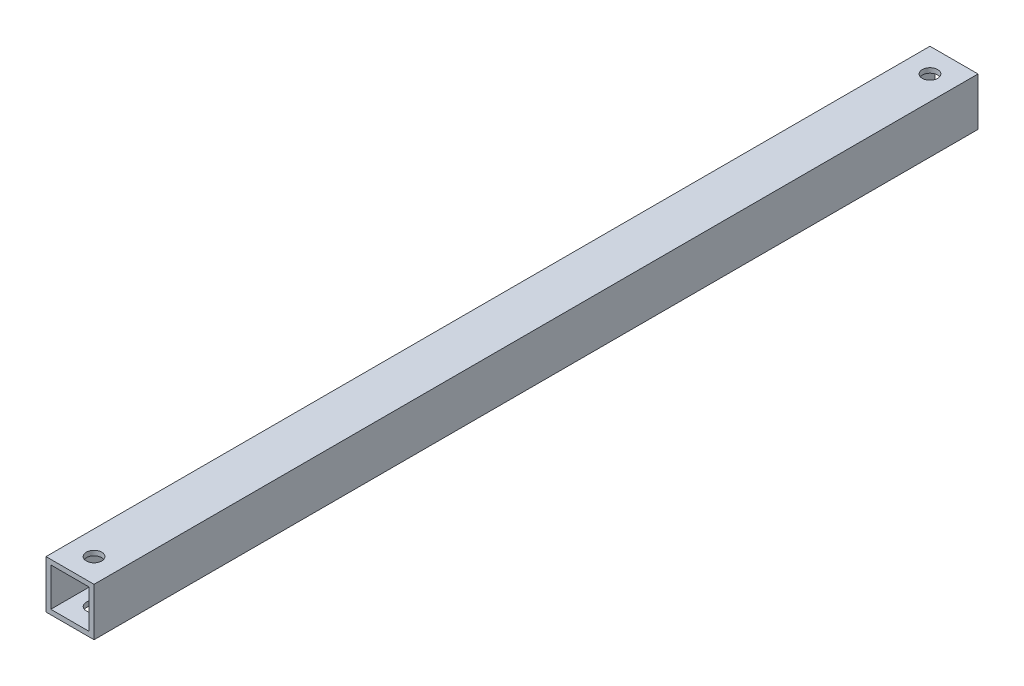
ISO-10303-21;
HEADER;
FILE_DESCRIPTION(('STEP AP214'),'2;1');
FILE_NAME('part.step','',(''),(''),'','','');
FILE_SCHEMA(('AUTOMOTIVE_DESIGN { 1 0 10303 214 1 1 1 1 }'));
ENDSEC;
DATA;
#1=APPLICATION_CONTEXT('core data for automotive mechanical design processes');
#2=APPLICATION_PROTOCOL_DEFINITION('international standard','automotive_design',2000,#1);
#3=PRODUCT_CONTEXT('',#1,'mechanical');
#4=PRODUCT('Part','Part','',(#3));
#5=PRODUCT_RELATED_PRODUCT_CATEGORY('part','',(#4));
#6=PRODUCT_DEFINITION_FORMATION('','',#4);
#7=PRODUCT_DEFINITION_CONTEXT('part definition',#1,'design');
#8=PRODUCT_DEFINITION('design','',#6,#7);
#9=PRODUCT_DEFINITION_SHAPE('','',#8);
#10=(LENGTH_UNIT() NAMED_UNIT(*) SI_UNIT(.MILLI.,.METRE.));
#11=(NAMED_UNIT(*) PLANE_ANGLE_UNIT() SI_UNIT($,.RADIAN.));
#12=(NAMED_UNIT(*) SI_UNIT($,.STERADIAN.) SOLID_ANGLE_UNIT());
#13=UNCERTAINTY_MEASURE_WITH_UNIT(LENGTH_MEASURE(1.E-05),#10,'distance_accuracy_value','');
#14=(GEOMETRIC_REPRESENTATION_CONTEXT(3) GLOBAL_UNCERTAINTY_ASSIGNED_CONTEXT((#13)) GLOBAL_UNIT_ASSIGNED_CONTEXT((#10,
#11,#12)) REPRESENTATION_CONTEXT('',''));
#15=CARTESIAN_POINT('',(0.,0.,0.));
#16=DIRECTION('',(0.,0.,1.));
#17=DIRECTION('',(1.,0.,0.));
#18=AXIS2_PLACEMENT_3D('',#15,#16,#17);
#19=CARTESIAN_POINT('',(0.,0.,184.));
#20=DIRECTION('',(0.,0.,1.));
#21=DIRECTION('',(1.,0.,0.));
#22=AXIS2_PLACEMENT_3D('',#19,#20,#21);
#23=PLANE('',#22);
#24=DIRECTION('',(0.,1.,0.));
#25=VECTOR('',#24,1.);
#26=CARTESIAN_POINT('',(5.,-5.,184.));
#27=LINE('',#26,#25);
#28=CARTESIAN_POINT('',(5.,-5.,184.));
#29=VERTEX_POINT('',#28);
#30=CARTESIAN_POINT('',(5.,5.,184.));
#31=VERTEX_POINT('',#30);
#32=EDGE_CURVE('E162',#29,#31,#27,.T.);
#33=ORIENTED_EDGE('',*,*,#32,.T.);
#34=DIRECTION('',(-1.,0.,0.));
#35=VECTOR('',#34,1.);
#36=CARTESIAN_POINT('',(-5.,5.,184.));
#37=LINE('',#36,#35);
#38=CARTESIAN_POINT('',(-5.,5.,184.));
#39=VERTEX_POINT('',#38);
#40=EDGE_CURVE('E165',#31,#39,#37,.T.);
#41=ORIENTED_EDGE('',*,*,#40,.T.);
#42=DIRECTION('',(0.,-1.,0.));
#43=VECTOR('',#42,1.);
#44=CARTESIAN_POINT('',(-5.,-5.,184.));
#45=LINE('',#44,#43);
#46=CARTESIAN_POINT('',(-5.,-5.,184.));
#47=VERTEX_POINT('',#46);
#48=EDGE_CURVE('E168',#39,#47,#45,.T.);
#49=ORIENTED_EDGE('',*,*,#48,.T.);
#50=DIRECTION('',(1.,0.,0.));
#51=VECTOR('',#50,1.);
#52=CARTESIAN_POINT('',(-5.,-5.,184.));
#53=LINE('',#52,#51);
#54=EDGE_CURVE('E170',#47,#29,#53,.T.);
#55=ORIENTED_EDGE('',*,*,#54,.T.);
#56=EDGE_LOOP('',(#33,#41,#49,#55));
#57=FACE_BOUND('',#56,.T.);
#58=DIRECTION('',(-1.,0.,0.));
#59=VECTOR('',#58,1.);
#60=CARTESIAN_POINT('',(0.,4.,184.));
#61=LINE('',#60,#59);
#62=CARTESIAN_POINT('',(4.,4.,184.));
#63=VERTEX_POINT('',#62);
#64=CARTESIAN_POINT('',(-4.,4.,184.));
#65=VERTEX_POINT('',#64);
#66=EDGE_CURVE('E132',#63,#65,#61,.T.);
#67=ORIENTED_EDGE('',*,*,#66,.F.);
#68=DIRECTION('',(0.,1.,0.));
#69=VECTOR('',#68,1.);
#70=CARTESIAN_POINT('',(4.,0.,184.));
#71=LINE('',#70,#69);
#72=CARTESIAN_POINT('',(4.,-4.,184.));
#73=VERTEX_POINT('',#72);
#74=EDGE_CURVE('E124',#73,#63,#71,.T.);
#75=ORIENTED_EDGE('',*,*,#74,.F.);
#76=DIRECTION('',(1.,0.,0.));
#77=VECTOR('',#76,1.);
#78=CARTESIAN_POINT('',(0.,-4.,184.));
#79=LINE('',#78,#77);
#80=CARTESIAN_POINT('',(-4.,-4.,184.));
#81=VERTEX_POINT('',#80);
#82=EDGE_CURVE('E146',#81,#73,#79,.T.);
#83=ORIENTED_EDGE('',*,*,#82,.F.);
#84=DIRECTION('',(0.,-1.,0.));
#85=VECTOR('',#84,1.);
#86=CARTESIAN_POINT('',(-4.,0.,184.));
#87=LINE('',#86,#85);
#88=EDGE_CURVE('E144',#65,#81,#87,.T.);
#89=ORIENTED_EDGE('',*,*,#88,.F.);
#90=EDGE_LOOP('',(#67,#75,#83,#89));
#91=FACE_BOUND('',#90,.T.);
#92=ADVANCED_FACE('F57',(#57,#91),#23,.T.);
#93=CARTESIAN_POINT('',(0.,0.,0.));
#94=DIRECTION('',(0.,0.,1.));
#95=DIRECTION('',(1.,0.,0.));
#96=AXIS2_PLACEMENT_3D('',#93,#94,#95);
#97=PLANE('',#96);
#98=DIRECTION('',(0.,1.,0.));
#99=VECTOR('',#98,1.);
#100=CARTESIAN_POINT('',(5.,-5.,0.));
#101=LINE('',#100,#99);
#102=CARTESIAN_POINT('',(5.,-5.,0.));
#103=VERTEX_POINT('',#102);
#104=CARTESIAN_POINT('',(5.,5.,0.));
#105=VERTEX_POINT('',#104);
#106=EDGE_CURVE('E140',#103,#105,#101,.T.);
#107=ORIENTED_EDGE('',*,*,#106,.F.);
#108=DIRECTION('',(1.,0.,0.));
#109=VECTOR('',#108,1.);
#110=CARTESIAN_POINT('',(-5.,-5.,0.));
#111=LINE('',#110,#109);
#112=CARTESIAN_POINT('',(-5.,-5.,0.));
#113=VERTEX_POINT('',#112);
#114=EDGE_CURVE('E166',#113,#103,#111,.T.);
#115=ORIENTED_EDGE('',*,*,#114,.F.);
#116=DIRECTION('',(0.,-1.,0.));
#117=VECTOR('',#116,1.);
#118=CARTESIAN_POINT('',(-5.,-5.,0.));
#119=LINE('',#118,#117);
#120=CARTESIAN_POINT('',(-5.,5.,0.));
#121=VERTEX_POINT('',#120);
#122=EDGE_CURVE('E177',#121,#113,#119,.T.);
#123=ORIENTED_EDGE('',*,*,#122,.F.);
#124=DIRECTION('',(-1.,0.,0.));
#125=VECTOR('',#124,1.);
#126=CARTESIAN_POINT('',(-5.,5.,0.));
#127=LINE('',#126,#125);
#128=EDGE_CURVE('E175',#105,#121,#127,.T.);
#129=ORIENTED_EDGE('',*,*,#128,.F.);
#130=EDGE_LOOP('',(#107,#115,#123,#129));
#131=FACE_BOUND('',#130,.T.);
#132=DIRECTION('',(0.,1.,0.));
#133=VECTOR('',#132,1.);
#134=CARTESIAN_POINT('',(4.,0.,0.));
#135=LINE('',#134,#133);
#136=CARTESIAN_POINT('',(4.,-4.,0.));
#137=VERTEX_POINT('',#136);
#138=CARTESIAN_POINT('',(4.,4.,0.));
#139=VERTEX_POINT('',#138);
#140=EDGE_CURVE('E82',#137,#139,#135,.T.);
#141=ORIENTED_EDGE('',*,*,#140,.T.);
#142=DIRECTION('',(-1.,0.,0.));
#143=VECTOR('',#142,1.);
#144=CARTESIAN_POINT('',(0.,4.,0.));
#145=LINE('',#144,#143);
#146=CARTESIAN_POINT('',(-4.,4.,0.));
#147=VERTEX_POINT('',#146);
#148=EDGE_CURVE('E139',#139,#147,#145,.T.);
#149=ORIENTED_EDGE('',*,*,#148,.T.);
#150=DIRECTION('',(0.,-1.,0.));
#151=VECTOR('',#150,1.);
#152=CARTESIAN_POINT('',(-4.,0.,0.));
#153=LINE('',#152,#151);
#154=CARTESIAN_POINT('',(-4.,-4.,0.));
#155=VERTEX_POINT('',#154);
#156=EDGE_CURVE('E154',#147,#155,#153,.T.);
#157=ORIENTED_EDGE('',*,*,#156,.T.);
#158=DIRECTION('',(1.,0.,0.));
#159=VECTOR('',#158,1.);
#160=CARTESIAN_POINT('',(0.,-4.,0.));
#161=LINE('',#160,#159);
#162=EDGE_CURVE('E133',#155,#137,#161,.T.);
#163=ORIENTED_EDGE('',*,*,#162,.T.);
#164=EDGE_LOOP('',(#141,#149,#157,#163));
#165=FACE_BOUND('',#164,.T.);
#166=ADVANCED_FACE('F224',(#131,#165),#97,.F.);
#167=CARTESIAN_POINT('',(5.,-5.,184.));
#168=DIRECTION('',(-1.,0.,0.));
#169=DIRECTION('',(0.,0.,1.));
#170=AXIS2_PLACEMENT_3D('',#167,#168,#169);
#171=PLANE('',#170);
#172=ORIENTED_EDGE('',*,*,#106,.T.);
#173=DIRECTION('',(0.,0.,-1.));
#174=VECTOR('',#173,1.);
#175=CARTESIAN_POINT('',(5.,5.,184.));
#176=LINE('',#175,#174);
#177=EDGE_CURVE('E12',#31,#105,#176,.T.);
#178=ORIENTED_EDGE('',*,*,#177,.F.);
#179=ORIENTED_EDGE('',*,*,#32,.F.);
#180=DIRECTION('',(0.,0.,-1.));
#181=VECTOR('',#180,1.);
#182=CARTESIAN_POINT('',(5.,-5.,184.));
#183=LINE('',#182,#181);
#184=EDGE_CURVE('E172',#29,#103,#183,.T.);
#185=ORIENTED_EDGE('',*,*,#184,.T.);
#186=EDGE_LOOP('',(#172,#178,#179,#185));
#187=FACE_BOUND('',#186,.T.);
#188=ADVANCED_FACE('F59',(#187),#171,.F.);
#189=CARTESIAN_POINT('',(-5.,5.,184.));
#190=DIRECTION('',(0.,-1.,0.));
#191=DIRECTION('',(0.,0.,-1.));
#192=AXIS2_PLACEMENT_3D('',#189,#190,#191);
#193=PLANE('',#192);
#194=CARTESIAN_POINT('',(0.,5.,5.));
#195=DIRECTION('',(0.,1.,0.));
#196=DIRECTION('',(0.,0.,1.));
#197=AXIS2_PLACEMENT_3D('',#194,#195,#196);
#198=CIRCLE('',#197,1.6);
#199=CARTESIAN_POINT('',(0.,5.,6.6));
#200=VERTEX_POINT('',#199);
#201=EDGE_CURVE('E195',#200,#200,#198,.T.);
#202=ORIENTED_EDGE('',*,*,#201,.F.);
#203=EDGE_LOOP('',(#202));
#204=FACE_BOUND('',#203,.T.);
#205=CARTESIAN_POINT('',(0.,5.,179.));
#206=DIRECTION('',(0.,1.,0.));
#207=DIRECTION('',(0.,0.,-1.));
#208=AXIS2_PLACEMENT_3D('',#205,#206,#207);
#209=CIRCLE('',#208,1.60000000000001);
#210=CARTESIAN_POINT('',(0.,5.,177.4));
#211=VERTEX_POINT('',#210);
#212=EDGE_CURVE('E205',#211,#211,#209,.T.);
#213=ORIENTED_EDGE('',*,*,#212,.F.);
#214=EDGE_LOOP('',(#213));
#215=FACE_BOUND('',#214,.T.);
#216=ORIENTED_EDGE('',*,*,#128,.T.);
#217=DIRECTION('',(0.,0.,-1.));
#218=VECTOR('',#217,1.);
#219=CARTESIAN_POINT('',(-5.,5.,184.));
#220=LINE('',#219,#218);
#221=EDGE_CURVE('E66',#39,#121,#220,.T.);
#222=ORIENTED_EDGE('',*,*,#221,.F.);
#223=ORIENTED_EDGE('',*,*,#40,.F.);
#224=ORIENTED_EDGE('',*,*,#177,.T.);
#225=EDGE_LOOP('',(#216,#222,#223,#224));
#226=FACE_BOUND('',#225,.T.);
#227=ADVANCED_FACE('F248',(#204,#215,#226),#193,.F.);
#228=CARTESIAN_POINT('',(-5.,-5.,184.));
#229=DIRECTION('',(1.,0.,0.));
#230=DIRECTION('',(0.,0.,-1.));
#231=AXIS2_PLACEMENT_3D('',#228,#229,#230);
#232=PLANE('',#231);
#233=ORIENTED_EDGE('',*,*,#122,.T.);
#234=DIRECTION('',(0.,0.,-1.));
#235=VECTOR('',#234,1.);
#236=CARTESIAN_POINT('',(-5.,-5.,184.));
#237=LINE('',#236,#235);
#238=EDGE_CURVE('E182',#47,#113,#237,.T.);
#239=ORIENTED_EDGE('',*,*,#238,.F.);
#240=ORIENTED_EDGE('',*,*,#48,.F.);
#241=ORIENTED_EDGE('',*,*,#221,.T.);
#242=EDGE_LOOP('',(#233,#239,#240,#241));
#243=FACE_BOUND('',#242,.T.);
#244=ADVANCED_FACE('F246',(#243),#232,.F.);
#245=CARTESIAN_POINT('',(-5.,-5.,184.));
#246=DIRECTION('',(0.,1.,0.));
#247=DIRECTION('',(0.,0.,1.));
#248=AXIS2_PLACEMENT_3D('',#245,#246,#247);
#249=PLANE('',#248);
#250=CARTESIAN_POINT('',(0.,-5.,5.));
#251=DIRECTION('',(0.,1.,0.));
#252=DIRECTION('',(0.,0.,1.));
#253=AXIS2_PLACEMENT_3D('',#250,#251,#252);
#254=CIRCLE('',#253,1.6);
#255=CARTESIAN_POINT('',(0.,-5.,6.6));
#256=VERTEX_POINT('',#255);
#257=EDGE_CURVE('E189',#256,#256,#254,.T.);
#258=ORIENTED_EDGE('',*,*,#257,.T.);
#259=EDGE_LOOP('',(#258));
#260=FACE_BOUND('',#259,.T.);
#261=CARTESIAN_POINT('',(0.,-5.,179.));
#262=DIRECTION('',(0.,1.,0.));
#263=DIRECTION('',(0.,0.,-1.));
#264=AXIS2_PLACEMENT_3D('',#261,#262,#263);
#265=CIRCLE('',#264,1.60000000000001);
#266=CARTESIAN_POINT('',(0.,-5.,177.4));
#267=VERTEX_POINT('',#266);
#268=EDGE_CURVE('E200',#267,#267,#265,.T.);
#269=ORIENTED_EDGE('',*,*,#268,.T.);
#270=EDGE_LOOP('',(#269));
#271=FACE_BOUND('',#270,.T.);
#272=ORIENTED_EDGE('',*,*,#114,.T.);
#273=ORIENTED_EDGE('',*,*,#184,.F.);
#274=ORIENTED_EDGE('',*,*,#54,.F.);
#275=ORIENTED_EDGE('',*,*,#238,.T.);
#276=EDGE_LOOP('',(#272,#273,#274,#275));
#277=FACE_BOUND('',#276,.T.);
#278=ADVANCED_FACE('F243',(#260,#271,#277),#249,.F.);
#279=CARTESIAN_POINT('',(4.,0.,184.));
#280=DIRECTION('',(-1.,0.,0.));
#281=DIRECTION('',(0.,0.,1.));
#282=AXIS2_PLACEMENT_3D('',#279,#280,#281);
#283=PLANE('',#282);
#284=ORIENTED_EDGE('',*,*,#140,.F.);
#285=DIRECTION('',(0.,0.,-1.));
#286=VECTOR('',#285,1.);
#287=CARTESIAN_POINT('',(4.,-4.,184.));
#288=LINE('',#287,#286);
#289=EDGE_CURVE('E128',#73,#137,#288,.T.);
#290=ORIENTED_EDGE('',*,*,#289,.F.);
#291=ORIENTED_EDGE('',*,*,#74,.T.);
#292=DIRECTION('',(0.,0.,-1.));
#293=VECTOR('',#292,1.);
#294=CARTESIAN_POINT('',(4.,4.,184.));
#295=LINE('',#294,#293);
#296=EDGE_CURVE('E127',#63,#139,#295,.T.);
#297=ORIENTED_EDGE('',*,*,#296,.T.);
#298=EDGE_LOOP('',(#284,#290,#291,#297));
#299=FACE_BOUND('',#298,.T.);
#300=ADVANCED_FACE('F126',(#299),#283,.T.);
#301=CARTESIAN_POINT('',(0.,4.,184.));
#302=DIRECTION('',(0.,-1.,0.));
#303=DIRECTION('',(0.,0.,-1.));
#304=AXIS2_PLACEMENT_3D('',#301,#302,#303);
#305=PLANE('',#304);
#306=CARTESIAN_POINT('',(0.,4.,5.));
#307=DIRECTION('',(0.,-1.,0.));
#308=DIRECTION('',(0.,0.,-1.));
#309=AXIS2_PLACEMENT_3D('',#306,#307,#308);
#310=CIRCLE('',#309,1.6);
#311=CARTESIAN_POINT('',(0.,4.,3.4));
#312=VERTEX_POINT('',#311);
#313=EDGE_CURVE('E152',#312,#312,#310,.T.);
#314=ORIENTED_EDGE('',*,*,#313,.F.);
#315=EDGE_LOOP('',(#314));
#316=FACE_BOUND('',#315,.T.);
#317=CARTESIAN_POINT('',(0.,4.,179.));
#318=DIRECTION('',(0.,-1.,0.));
#319=DIRECTION('',(0.,0.,-1.));
#320=AXIS2_PLACEMENT_3D('',#317,#318,#319);
#321=CIRCLE('',#320,1.60000000000001);
#322=CARTESIAN_POINT('',(0.,4.,177.4));
#323=VERTEX_POINT('',#322);
#324=EDGE_CURVE('E188',#323,#323,#321,.T.);
#325=ORIENTED_EDGE('',*,*,#324,.F.);
#326=EDGE_LOOP('',(#325));
#327=FACE_BOUND('',#326,.T.);
#328=ORIENTED_EDGE('',*,*,#148,.F.);
#329=ORIENTED_EDGE('',*,*,#296,.F.);
#330=ORIENTED_EDGE('',*,*,#66,.T.);
#331=DIRECTION('',(0.,0.,-1.));
#332=VECTOR('',#331,1.);
#333=CARTESIAN_POINT('',(-4.,4.,184.));
#334=LINE('',#333,#332);
#335=EDGE_CURVE('E141',#65,#147,#334,.T.);
#336=ORIENTED_EDGE('',*,*,#335,.T.);
#337=EDGE_LOOP('',(#328,#329,#330,#336));
#338=FACE_BOUND('',#337,.T.);
#339=ADVANCED_FACE('F136',(#316,#327,#338),#305,.T.);
#340=CARTESIAN_POINT('',(-4.,0.,184.));
#341=DIRECTION('',(1.,0.,0.));
#342=DIRECTION('',(0.,0.,-1.));
#343=AXIS2_PLACEMENT_3D('',#340,#341,#342);
#344=PLANE('',#343);
#345=ORIENTED_EDGE('',*,*,#156,.F.);
#346=ORIENTED_EDGE('',*,*,#335,.F.);
#347=ORIENTED_EDGE('',*,*,#88,.T.);
#348=DIRECTION('',(0.,0.,-1.));
#349=VECTOR('',#348,1.);
#350=CARTESIAN_POINT('',(-4.,-4.,184.));
#351=LINE('',#350,#349);
#352=EDGE_CURVE('E74',#81,#155,#351,.T.);
#353=ORIENTED_EDGE('',*,*,#352,.T.);
#354=EDGE_LOOP('',(#345,#346,#347,#353));
#355=FACE_BOUND('',#354,.T.);
#356=ADVANCED_FACE('F220',(#355),#344,.T.);
#357=CARTESIAN_POINT('',(0.,-4.,184.));
#358=DIRECTION('',(0.,1.,0.));
#359=DIRECTION('',(0.,0.,1.));
#360=AXIS2_PLACEMENT_3D('',#357,#358,#359);
#361=PLANE('',#360);
#362=CARTESIAN_POINT('',(0.,-4.,5.));
#363=DIRECTION('',(0.,1.,0.));
#364=DIRECTION('',(0.,0.,1.));
#365=AXIS2_PLACEMENT_3D('',#362,#363,#364);
#366=CIRCLE('',#365,1.6);
#367=CARTESIAN_POINT('',(0.,-4.,6.6));
#368=VERTEX_POINT('',#367);
#369=EDGE_CURVE('E61',#368,#368,#366,.T.);
#370=ORIENTED_EDGE('',*,*,#369,.F.);
#371=EDGE_LOOP('',(#370));
#372=FACE_BOUND('',#371,.T.);
#373=CARTESIAN_POINT('',(0.,-4.,179.));
#374=DIRECTION('',(0.,1.,0.));
#375=DIRECTION('',(0.,0.,1.));
#376=AXIS2_PLACEMENT_3D('',#373,#374,#375);
#377=CIRCLE('',#376,1.60000000000001);
#378=CARTESIAN_POINT('',(0.,-4.,180.6));
#379=VERTEX_POINT('',#378);
#380=EDGE_CURVE('E186',#379,#379,#377,.T.);
#381=ORIENTED_EDGE('',*,*,#380,.F.);
#382=EDGE_LOOP('',(#381));
#383=FACE_BOUND('',#382,.T.);
#384=ORIENTED_EDGE('',*,*,#162,.F.);
#385=ORIENTED_EDGE('',*,*,#352,.F.);
#386=ORIENTED_EDGE('',*,*,#82,.T.);
#387=ORIENTED_EDGE('',*,*,#289,.T.);
#388=EDGE_LOOP('',(#384,#385,#386,#387));
#389=FACE_BOUND('',#388,.T.);
#390=ADVANCED_FACE('F216',(#372,#383,#389),#361,.T.);
#391=CARTESIAN_POINT('',(0.,-5.,179.));
#392=DIRECTION('',(0.,1.,0.));
#393=DIRECTION('',(0.,0.,1.));
#394=AXIS2_PLACEMENT_3D('',#391,#392,#393);
#395=CYLINDRICAL_SURFACE('',#394,1.60000000000001);
#396=ORIENTED_EDGE('',*,*,#380,.T.);
#397=EDGE_LOOP('',(#396));
#398=FACE_BOUND('',#397,.T.);
#399=ORIENTED_EDGE('',*,*,#268,.F.);
#400=EDGE_LOOP('',(#399));
#401=FACE_BOUND('',#400,.T.);
#402=ADVANCED_FACE('F219',(#398,#401),#395,.F.);
#403=CARTESIAN_POINT('',(0.,-5.,5.));
#404=DIRECTION('',(0.,1.,0.));
#405=DIRECTION('',(0.,0.,1.));
#406=AXIS2_PLACEMENT_3D('',#403,#404,#405);
#407=CYLINDRICAL_SURFACE('',#406,1.6);
#408=ORIENTED_EDGE('',*,*,#369,.T.);
#409=EDGE_LOOP('',(#408));
#410=FACE_BOUND('',#409,.T.);
#411=ORIENTED_EDGE('',*,*,#257,.F.);
#412=EDGE_LOOP('',(#411));
#413=FACE_BOUND('',#412,.T.);
#414=ADVANCED_FACE('F213',(#410,#413),#407,.F.);
#415=ORIENTED_EDGE('',*,*,#324,.T.);
#416=EDGE_LOOP('',(#415));
#417=FACE_BOUND('',#416,.T.);
#418=ORIENTED_EDGE('',*,*,#212,.T.);
#419=EDGE_LOOP('',(#418));
#420=FACE_BOUND('',#419,.T.);
#421=ADVANCED_FACE('F272',(#417,#420),#395,.F.);
#422=ORIENTED_EDGE('',*,*,#313,.T.);
#423=EDGE_LOOP('',(#422));
#424=FACE_BOUND('',#423,.T.);
#425=ORIENTED_EDGE('',*,*,#201,.T.);
#426=EDGE_LOOP('',(#425));
#427=FACE_BOUND('',#426,.T.);
#428=ADVANCED_FACE('F274',(#424,#427),#407,.F.);
#429=CLOSED_SHELL('',(#92,#166,#188,#227,#244,#278,#300,#339,#356,#390,#402,#414,#421,#428));
#430=MANIFOLD_SOLID_BREP('B2',#429);
#431=ADVANCED_BREP_SHAPE_REPRESENTATION('',(#18,#430),#14);
#432=SHAPE_DEFINITION_REPRESENTATION(#9,#431);
ENDSEC;
END-ISO-10303-21;
